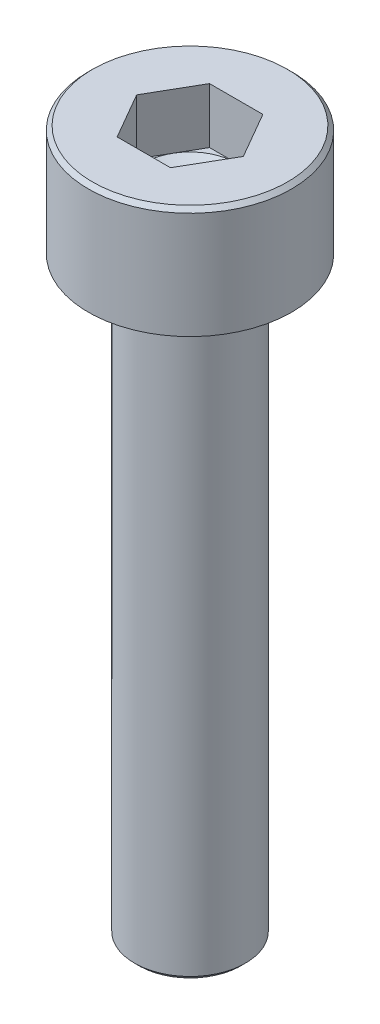
ISO-10303-21;
HEADER;
FILE_DESCRIPTION(('STEP AP214'),'2;1');
FILE_NAME('part.step','',(''),(''),'','','');
FILE_SCHEMA(('AUTOMOTIVE_DESIGN { 1 0 10303 214 1 1 1 1 }'));
ENDSEC;
DATA;
#1=APPLICATION_CONTEXT('core data for automotive mechanical design processes');
#2=APPLICATION_PROTOCOL_DEFINITION('international standard','automotive_design',2000,#1);
#3=PRODUCT_CONTEXT('',#1,'mechanical');
#4=PRODUCT('Part','Part','',(#3));
#5=PRODUCT_RELATED_PRODUCT_CATEGORY('part','',(#4));
#6=PRODUCT_DEFINITION_FORMATION('','',#4);
#7=PRODUCT_DEFINITION_CONTEXT('part definition',#1,'design');
#8=PRODUCT_DEFINITION('design','',#6,#7);
#9=PRODUCT_DEFINITION_SHAPE('','',#8);
#10=(LENGTH_UNIT() NAMED_UNIT(*) SI_UNIT(.MILLI.,.METRE.));
#11=(NAMED_UNIT(*) PLANE_ANGLE_UNIT() SI_UNIT($,.RADIAN.));
#12=(NAMED_UNIT(*) SI_UNIT($,.STERADIAN.) SOLID_ANGLE_UNIT());
#13=UNCERTAINTY_MEASURE_WITH_UNIT(LENGTH_MEASURE(1.E-05),#10,'distance_accuracy_value','');
#14=(GEOMETRIC_REPRESENTATION_CONTEXT(3) GLOBAL_UNCERTAINTY_ASSIGNED_CONTEXT((#13)) GLOBAL_UNIT_ASSIGNED_CONTEXT((#10,
#11,#12)) REPRESENTATION_CONTEXT('',''));
#15=CARTESIAN_POINT('',(0.,0.,0.));
#16=DIRECTION('',(0.,0.,1.));
#17=DIRECTION('',(1.,0.,0.));
#18=AXIS2_PLACEMENT_3D('',#15,#16,#17);
#19=CARTESIAN_POINT('',(2.75,0.,0.));
#20=DIRECTION('',(0.,1.,0.));
#21=DIRECTION('',(-1.,0.,0.));
#22=AXIS2_PLACEMENT_3D('',#19,#20,#21);
#23=PLANE('',#22);
#24=DIRECTION('',(-0.5,0.,0.866025403784439));
#25=VECTOR('',#24,1.);
#26=CARTESIAN_POINT('',(-0.721687836487033,0.,-1.25));
#27=LINE('',#26,#25);
#28=CARTESIAN_POINT('',(-0.721687836487033,0.,-1.25));
#29=VERTEX_POINT('',#28);
#30=CARTESIAN_POINT('',(-1.44337567297407,0.,0.));
#31=VERTEX_POINT('',#30);
#32=EDGE_CURVE('E160',#29,#31,#27,.T.);
#33=ORIENTED_EDGE('',*,*,#32,.F.);
#34=DIRECTION('',(-1.,0.,0.));
#35=VECTOR('',#34,1.);
#36=CARTESIAN_POINT('',(0.721687836487031,0.,-1.25));
#37=LINE('',#36,#35);
#38=CARTESIAN_POINT('',(0.721687836487031,0.,-1.25));
#39=VERTEX_POINT('',#38);
#40=EDGE_CURVE('E158',#39,#29,#37,.T.);
#41=ORIENTED_EDGE('',*,*,#40,.F.);
#42=DIRECTION('',(-0.5,0.,-0.866025403784439));
#43=VECTOR('',#42,1.);
#44=CARTESIAN_POINT('',(1.44337567297406,0.,0.));
#45=LINE('',#44,#43);
#46=CARTESIAN_POINT('',(1.44337567297406,0.,0.));
#47=VERTEX_POINT('',#46);
#48=EDGE_CURVE('E156',#47,#39,#45,.T.);
#49=ORIENTED_EDGE('',*,*,#48,.F.);
#50=DIRECTION('',(0.5,0.,-0.866025403784439));
#51=VECTOR('',#50,1.);
#52=CARTESIAN_POINT('',(0.721687836487032,0.,1.25));
#53=LINE('',#52,#51);
#54=CARTESIAN_POINT('',(0.721687836487032,0.,1.25));
#55=VERTEX_POINT('',#54);
#56=EDGE_CURVE('E154',#55,#47,#53,.T.);
#57=ORIENTED_EDGE('',*,*,#56,.F.);
#58=DIRECTION('',(1.,0.,0.));
#59=VECTOR('',#58,1.);
#60=CARTESIAN_POINT('',(-0.721687836487033,0.,1.25));
#61=LINE('',#60,#59);
#62=CARTESIAN_POINT('',(-0.721687836487033,0.,1.25));
#63=VERTEX_POINT('',#62);
#64=EDGE_CURVE('E129',#63,#55,#61,.T.);
#65=ORIENTED_EDGE('',*,*,#64,.F.);
#66=DIRECTION('',(0.5,0.,0.866025403784439));
#67=VECTOR('',#66,1.);
#68=CARTESIAN_POINT('',(-1.44337567297407,0.,0.));
#69=LINE('',#68,#67);
#70=EDGE_CURVE('E122',#31,#63,#69,.T.);
#71=ORIENTED_EDGE('',*,*,#70,.F.);
#72=EDGE_LOOP('',(#33,#41,#49,#57,#65,#71));
#73=FACE_BOUND('',#72,.T.);
#74=CARTESIAN_POINT('',(0.,0.,0.));
#75=DIRECTION('',(0.,1.,0.));
#76=DIRECTION('',(-1.,0.,0.));
#77=AXIS2_PLACEMENT_3D('',#74,#75,#76);
#78=CIRCLE('',#77,2.64);
#79=CARTESIAN_POINT('',(-2.64,0.,0.));
#80=VERTEX_POINT('',#79);
#81=EDGE_CURVE('E47',#80,#80,#78,.T.);
#82=ORIENTED_EDGE('',*,*,#81,.T.);
#83=EDGE_LOOP('',(#82));
#84=FACE_BOUND('',#83,.T.);
#85=ADVANCED_FACE('F38',(#73,#84),#23,.T.);
#86=CARTESIAN_POINT('',(1.5,-19.,0.));
#87=DIRECTION('',(0.,-1.,0.));
#88=DIRECTION('',(1.,0.,0.));
#89=AXIS2_PLACEMENT_3D('',#86,#87,#88);
#90=PLANE('',#89);
#91=CARTESIAN_POINT('',(0.,-19.,0.));
#92=DIRECTION('',(0.,-1.,0.));
#93=DIRECTION('',(1.,0.,0.));
#94=AXIS2_PLACEMENT_3D('',#91,#92,#93);
#95=CIRCLE('',#94,0.6);
#96=CARTESIAN_POINT('',(0.600000000000003,-19.,0.));
#97=VERTEX_POINT('',#96);
#98=EDGE_CURVE('E267',#97,#97,#95,.T.);
#99=ORIENTED_EDGE('',*,*,#98,.F.);
#100=EDGE_LOOP('',(#99));
#101=FACE_BOUND('',#100,.T.);
#102=CARTESIAN_POINT('',(0.,-19.,0.));
#103=DIRECTION('',(0.,-1.,0.));
#104=DIRECTION('',(1.,0.,0.));
#105=AXIS2_PLACEMENT_3D('',#102,#103,#104);
#106=CIRCLE('',#105,1.38);
#107=CARTESIAN_POINT('',(-1.38,-19.,0.));
#108=VERTEX_POINT('',#107);
#109=EDGE_CURVE('E190',#108,#108,#106,.T.);
#110=ORIENTED_EDGE('',*,*,#109,.T.);
#111=EDGE_LOOP('',(#110));
#112=FACE_BOUND('',#111,.T.);
#113=ADVANCED_FACE('F210',(#101,#112),#90,.T.);
#114=CARTESIAN_POINT('',(0.,-2.22168783648703,0.));
#115=DIRECTION('',(0.,1.,0.));
#116=DIRECTION('',(-1.,0.,0.));
#117=AXIS2_PLACEMENT_3D('',#114,#115,#116);
#118=CYLINDRICAL_SURFACE('',#117,1.5);
#119=CARTESIAN_POINT('',(0.,-18.88,0.));
#120=DIRECTION('',(0.,-1.,0.));
#121=DIRECTION('',(1.,0.,0.));
#122=AXIS2_PLACEMENT_3D('',#119,#120,#121);
#123=CIRCLE('',#122,1.5);
#124=CARTESIAN_POINT('',(-1.5,-18.88,0.));
#125=VERTEX_POINT('',#124);
#126=EDGE_CURVE('E187',#125,#125,#123,.F.);
#127=ORIENTED_EDGE('',*,*,#126,.T.);
#128=EDGE_LOOP('',(#127));
#129=FACE_BOUND('',#128,.T.);
#130=CARTESIAN_POINT('',(0.,-3.,0.));
#131=DIRECTION('',(0.,1.,0.));
#132=DIRECTION('',(-1.,0.,0.));
#133=AXIS2_PLACEMENT_3D('',#130,#131,#132);
#134=CIRCLE('',#133,1.5);
#135=CARTESIAN_POINT('',(-1.5,-3.,0.));
#136=VERTEX_POINT('',#135);
#137=EDGE_CURVE('E180',#136,#136,#134,.T.);
#138=ORIENTED_EDGE('',*,*,#137,.F.);
#139=EDGE_LOOP('',(#138));
#140=FACE_BOUND('',#139,.T.);
#141=ADVANCED_FACE('F216',(#129,#140),#118,.T.);
#142=CARTESIAN_POINT('',(1.5,-3.,0.));
#143=DIRECTION('',(0.,-1.,0.));
#144=DIRECTION('',(1.,0.,0.));
#145=AXIS2_PLACEMENT_3D('',#142,#143,#144);
#146=PLANE('',#145);
#147=ORIENTED_EDGE('',*,*,#137,.T.);
#148=EDGE_LOOP('',(#147));
#149=FACE_BOUND('',#148,.T.);
#150=CARTESIAN_POINT('',(0.,-3.,0.));
#151=DIRECTION('',(0.,1.,0.));
#152=DIRECTION('',(-1.,0.,0.));
#153=AXIS2_PLACEMENT_3D('',#150,#151,#152);
#154=CIRCLE('',#153,2.75);
#155=CARTESIAN_POINT('',(-2.75,-3.,0.));
#156=VERTEX_POINT('',#155);
#157=EDGE_CURVE('E166',#156,#156,#154,.T.);
#158=ORIENTED_EDGE('',*,*,#157,.F.);
#159=EDGE_LOOP('',(#158));
#160=FACE_BOUND('',#159,.T.);
#161=ADVANCED_FACE('F229',(#149,#160),#146,.T.);
#162=CARTESIAN_POINT('',(0.,-2.22168783648703,0.));
#163=DIRECTION('',(0.,1.,0.));
#164=DIRECTION('',(-1.,0.,0.));
#165=AXIS2_PLACEMENT_3D('',#162,#163,#164);
#166=CYLINDRICAL_SURFACE('',#165,2.75);
#167=CARTESIAN_POINT('',(0.,-0.110000000000001,0.));
#168=DIRECTION('',(0.,1.,0.));
#169=DIRECTION('',(-1.,0.,0.));
#170=AXIS2_PLACEMENT_3D('',#167,#168,#169);
#171=CIRCLE('',#170,2.75);
#172=CARTESIAN_POINT('',(-2.75,-0.110000000000001,0.));
#173=VERTEX_POINT('',#172);
#174=EDGE_CURVE('E11',#173,#173,#171,.F.);
#175=ORIENTED_EDGE('',*,*,#174,.T.);
#176=EDGE_LOOP('',(#175));
#177=FACE_BOUND('',#176,.T.);
#178=ORIENTED_EDGE('',*,*,#157,.T.);
#179=EDGE_LOOP('',(#178));
#180=FACE_BOUND('',#179,.T.);
#181=ADVANCED_FACE('F206',(#177,#180),#166,.T.);
#182=CARTESIAN_POINT('',(0.,-18.88,0.));
#183=DIRECTION('',(0.,1.,0.));
#184=DIRECTION('',(-1.,0.,0.));
#185=AXIS2_PLACEMENT_3D('',#182,#183,#184);
#186=CONICAL_SURFACE('',#185,1.5,0.785398163397451);
#187=CARTESIAN_POINT('',(-1.38,-19.,0.));
#188=CARTESIAN_POINT('',(-1.38125,-18.99875,0.));
#189=CARTESIAN_POINT('',(-1.3825,-18.9975,0.));
#190=CARTESIAN_POINT('',(-1.385,-18.995,0.));
#191=CARTESIAN_POINT('',(-1.38625,-18.99375,0.));
#192=CARTESIAN_POINT('',(-1.38875,-18.99125,0.));
#193=CARTESIAN_POINT('',(-1.39,-18.99,0.));
#194=CARTESIAN_POINT('',(-1.3925,-18.9875,0.));
#195=CARTESIAN_POINT('',(-1.39375,-18.98625,0.));
#196=CARTESIAN_POINT('',(-1.39625,-18.98375,0.));
#197=CARTESIAN_POINT('',(-1.3975,-18.9825,0.));
#198=CARTESIAN_POINT('',(-1.4,-18.98,0.));
#199=CARTESIAN_POINT('',(-1.40125,-18.97875,0.));
#200=CARTESIAN_POINT('',(-1.40375,-18.97625,0.));
#201=CARTESIAN_POINT('',(-1.405,-18.975,0.));
#202=CARTESIAN_POINT('',(-1.4075,-18.9725,0.));
#203=CARTESIAN_POINT('',(-1.40875,-18.97125,0.));
#204=CARTESIAN_POINT('',(-1.41125,-18.96875,0.));
#205=CARTESIAN_POINT('',(-1.4125,-18.9675,0.));
#206=CARTESIAN_POINT('',(-1.415,-18.965,0.));
#207=CARTESIAN_POINT('',(-1.41625,-18.96375,0.));
#208=CARTESIAN_POINT('',(-1.41875,-18.96125,0.));
#209=CARTESIAN_POINT('',(-1.42,-18.96,0.));
#210=CARTESIAN_POINT('',(-1.4225,-18.9575,0.));
#211=CARTESIAN_POINT('',(-1.42375,-18.95625,0.));
#212=CARTESIAN_POINT('',(-1.42625,-18.95375,0.));
#213=CARTESIAN_POINT('',(-1.4275,-18.9525,0.));
#214=CARTESIAN_POINT('',(-1.43,-18.95,0.));
#215=CARTESIAN_POINT('',(-1.43125,-18.94875,0.));
#216=CARTESIAN_POINT('',(-1.43375,-18.94625,0.));
#217=CARTESIAN_POINT('',(-1.435,-18.945,0.));
#218=CARTESIAN_POINT('',(-1.4375,-18.9425,0.));
#219=CARTESIAN_POINT('',(-1.43875,-18.94125,0.));
#220=CARTESIAN_POINT('',(-1.44125,-18.93875,0.));
#221=CARTESIAN_POINT('',(-1.4425,-18.9375,0.));
#222=CARTESIAN_POINT('',(-1.445,-18.935,0.));
#223=CARTESIAN_POINT('',(-1.44625,-18.93375,0.));
#224=CARTESIAN_POINT('',(-1.44875,-18.93125,0.));
#225=CARTESIAN_POINT('',(-1.45,-18.93,0.));
#226=CARTESIAN_POINT('',(-1.4525,-18.9275,0.));
#227=CARTESIAN_POINT('',(-1.45375,-18.92625,0.));
#228=CARTESIAN_POINT('',(-1.45625,-18.92375,0.));
#229=CARTESIAN_POINT('',(-1.4575,-18.9225,0.));
#230=CARTESIAN_POINT('',(-1.46,-18.92,0.));
#231=CARTESIAN_POINT('',(-1.46125,-18.91875,0.));
#232=CARTESIAN_POINT('',(-1.46375,-18.91625,0.));
#233=CARTESIAN_POINT('',(-1.465,-18.915,0.));
#234=CARTESIAN_POINT('',(-1.4675,-18.9125,0.));
#235=CARTESIAN_POINT('',(-1.46875,-18.91125,0.));
#236=CARTESIAN_POINT('',(-1.47125,-18.90875,0.));
#237=CARTESIAN_POINT('',(-1.4725,-18.9075,0.));
#238=CARTESIAN_POINT('',(-1.475,-18.905,0.));
#239=CARTESIAN_POINT('',(-1.47625,-18.90375,0.));
#240=CARTESIAN_POINT('',(-1.47875,-18.90125,0.));
#241=CARTESIAN_POINT('',(-1.48,-18.9,0.));
#242=CARTESIAN_POINT('',(-1.4825,-18.8975,0.));
#243=CARTESIAN_POINT('',(-1.48375,-18.89625,0.));
#244=CARTESIAN_POINT('',(-1.48625,-18.89375,0.));
#245=CARTESIAN_POINT('',(-1.4875,-18.8925,0.));
#246=CARTESIAN_POINT('',(-1.49,-18.89,0.));
#247=CARTESIAN_POINT('',(-1.49125,-18.88875,0.));
#248=CARTESIAN_POINT('',(-1.49375,-18.88625,0.));
#249=CARTESIAN_POINT('',(-1.495,-18.885,0.));
#250=CARTESIAN_POINT('',(-1.4975,-18.8825,0.));
#251=CARTESIAN_POINT('',(-1.49875,-18.88125,0.));
#252=CARTESIAN_POINT('',(-1.5,-18.88,0.));
#253=B_SPLINE_CURVE_WITH_KNOTS('',3,(#187,#188,#189,#190,#191,#192,#193,#194,#195,#196,#197,
#198,#199,#200,#201,#202,#203,#204,#205,#206,#207,#208,#209,#210,#211,#212,#213,#214,#215,#216,
#217,#218,#219,#220,#221,#222,#223,#224,#225,#226,#227,#228,#229,#230,#231,#232,#233,#234,#235,
#236,#237,#238,#239,#240,#241,#242,#243,#244,#245,#246,#247,#248,#249,#250,#251,#252),
.UNSPECIFIED.,.F.,.F.,(4,2,2,2,2,2,2,2,2,2,2,2,2,2,2,2,2,2,2,2,2,2,2,2,2,2,2,2,2,2,2,2,4),(0.,
0.00530330085889674,0.0106066017177959,0.0159099025766951,0.0212132034355943,0.0265165042944937,
0.0318198051533929,0.0371231060122921,0.0424264068711913,0.047729707730088,0.0530330085889872,
0.0583363094478864,0.0636396103067856,0.0689429111656848,0.074246212024584,0.0795495128834832,
0.0848528137423825,0.0901561146012793,0.0954594154601785,0.100762716319078,0.106066017177977,
0.111369318036876,0.116672618895775,0.121975919754674,0.127279220613574,0.13258252147247,
0.13788582233137,0.143189123190269,0.148492424049168,0.153795724908067,0.159099025766967,
0.164402326625866,0.169705627484765),.UNSPECIFIED.);
#254=EDGE_CURVE('BSEAM198',#108,#125,#253,.T.);
#255=ORIENTED_EDGE('',*,*,#109,.F.);
#256=ORIENTED_EDGE('',*,*,#126,.F.);
#257=ORIENTED_EDGE('',*,*,#254,.T.);
#258=ORIENTED_EDGE('',*,*,#254,.F.);
#259=EDGE_LOOP('',(#255,#257,#256,#258));
#260=FACE_BOUND('',#259,.T.);
#261=ADVANCED_FACE('F198',(#260),#186,.T.);
#262=CARTESIAN_POINT('',(0.,0.,0.));
#263=DIRECTION('',(0.,-1.,0.));
#264=DIRECTION('',(1.,0.,0.));
#265=AXIS2_PLACEMENT_3D('',#262,#263,#264);
#266=CONICAL_SURFACE('',#265,2.64,0.785398163397452);
#267=ORIENTED_EDGE('',*,*,#174,.F.);
#268=EDGE_LOOP('',(#267));
#269=FACE_BOUND('',#268,.T.);
#270=ORIENTED_EDGE('',*,*,#81,.F.);
#271=EDGE_LOOP('',(#270));
#272=FACE_BOUND('',#271,.T.);
#273=ADVANCED_FACE('F40',(#269,#272),#266,.T.);
#274=CARTESIAN_POINT('',(-0.721687836487033,-1.5,1.25));
#275=DIRECTION('',(0.,0.,1.));
#276=DIRECTION('',(1.,0.,0.));
#277=AXIS2_PLACEMENT_3D('',#274,#275,#276);
#278=PLANE('',#277);
#279=DIRECTION('',(1.,0.,0.));
#280=VECTOR('',#279,1.);
#281=CARTESIAN_POINT('',(-0.721687836487033,-1.5,1.25));
#282=LINE('',#281,#280);
#283=CARTESIAN_POINT('',(-0.721687836487033,-1.5,1.25));
#284=VERTEX_POINT('',#283);
#285=CARTESIAN_POINT('',(0.,-1.5,1.25));
#286=VERTEX_POINT('',#285);
#287=EDGE_CURVE('E121',#284,#286,#282,.T.);
#288=ORIENTED_EDGE('',*,*,#287,.F.);
#289=DIRECTION('',(0.,1.,0.));
#290=VECTOR('',#289,1.);
#291=CARTESIAN_POINT('',(-0.721687836487033,-1.5,1.25));
#292=LINE('',#291,#290);
#293=EDGE_CURVE('E164',#284,#63,#292,.T.);
#294=ORIENTED_EDGE('',*,*,#293,.T.);
#295=ORIENTED_EDGE('',*,*,#64,.T.);
#296=DIRECTION('',(0.,1.,0.));
#297=VECTOR('',#296,1.);
#298=CARTESIAN_POINT('',(0.721687836487032,-1.5,1.25));
#299=LINE('',#298,#297);
#300=CARTESIAN_POINT('',(0.721687836487032,-1.5,1.25));
#301=VERTEX_POINT('',#300);
#302=EDGE_CURVE('E125',#301,#55,#299,.T.);
#303=ORIENTED_EDGE('',*,*,#302,.F.);
#304=EDGE_CURVE('E111',#286,#301,#282,.T.);
#305=ORIENTED_EDGE('',*,*,#304,.F.);
#306=EDGE_LOOP('',(#288,#294,#295,#303,#305));
#307=FACE_BOUND('',#306,.T.);
#308=ADVANCED_FACE('F126',(#307),#278,.F.);
#309=CARTESIAN_POINT('',(-1.44337567297407,-1.5,0.));
#310=DIRECTION('',(-0.866025403784439,0.,0.5));
#311=DIRECTION('',(0.5,0.,0.866025403784439));
#312=AXIS2_PLACEMENT_3D('',#309,#310,#311);
#313=PLANE('',#312);
#314=DIRECTION('',(0.5,0.,0.866025403784439));
#315=VECTOR('',#314,1.);
#316=CARTESIAN_POINT('',(-1.44337567297407,-1.5,0.));
#317=LINE('',#316,#315);
#318=CARTESIAN_POINT('',(-1.44337567297407,-1.5,0.));
#319=VERTEX_POINT('',#318);
#320=CARTESIAN_POINT('',(-1.08253175473055,-1.5,0.625));
#321=VERTEX_POINT('',#320);
#322=EDGE_CURVE('E54',#319,#321,#317,.T.);
#323=ORIENTED_EDGE('',*,*,#322,.F.);
#324=DIRECTION('',(0.,1.,0.));
#325=VECTOR('',#324,1.);
#326=CARTESIAN_POINT('',(-1.44337567297407,-1.5,0.));
#327=LINE('',#326,#325);
#328=EDGE_CURVE('E167',#319,#31,#327,.T.);
#329=ORIENTED_EDGE('',*,*,#328,.T.);
#330=ORIENTED_EDGE('',*,*,#70,.T.);
#331=ORIENTED_EDGE('',*,*,#293,.F.);
#332=EDGE_CURVE('E151',#321,#284,#317,.T.);
#333=ORIENTED_EDGE('',*,*,#332,.F.);
#334=EDGE_LOOP('',(#323,#329,#330,#331,#333));
#335=FACE_BOUND('',#334,.T.);
#336=ADVANCED_FACE('F204',(#335),#313,.F.);
#337=CARTESIAN_POINT('',(-0.721687836487033,-1.5,-1.25));
#338=DIRECTION('',(-0.866025403784439,0.,-0.5));
#339=DIRECTION('',(-0.5,0.,0.866025403784439));
#340=AXIS2_PLACEMENT_3D('',#337,#338,#339);
#341=PLANE('',#340);
#342=DIRECTION('',(-0.5,0.,0.866025403784439));
#343=VECTOR('',#342,1.);
#344=CARTESIAN_POINT('',(-0.721687836487033,-1.5,-1.25));
#345=LINE('',#344,#343);
#346=CARTESIAN_POINT('',(-0.721687836487033,-1.5,-1.25));
#347=VERTEX_POINT('',#346);
#348=CARTESIAN_POINT('',(-1.08253175473055,-1.5,-0.625));
#349=VERTEX_POINT('',#348);
#350=EDGE_CURVE('E148',#347,#349,#345,.T.);
#351=ORIENTED_EDGE('',*,*,#350,.F.);
#352=DIRECTION('',(0.,1.,0.));
#353=VECTOR('',#352,1.);
#354=CARTESIAN_POINT('',(-0.721687836487033,-1.5,-1.25));
#355=LINE('',#354,#353);
#356=EDGE_CURVE('E170',#347,#29,#355,.T.);
#357=ORIENTED_EDGE('',*,*,#356,.T.);
#358=ORIENTED_EDGE('',*,*,#32,.T.);
#359=ORIENTED_EDGE('',*,*,#328,.F.);
#360=EDGE_CURVE('E147',#349,#319,#345,.T.);
#361=ORIENTED_EDGE('',*,*,#360,.F.);
#362=EDGE_LOOP('',(#351,#357,#358,#359,#361));
#363=FACE_BOUND('',#362,.T.);
#364=ADVANCED_FACE('F247',(#363),#341,.F.);
#365=CARTESIAN_POINT('',(0.721687836487031,-1.5,-1.25));
#366=DIRECTION('',(0.,0.,-1.));
#367=DIRECTION('',(-1.,0.,0.));
#368=AXIS2_PLACEMENT_3D('',#365,#366,#367);
#369=PLANE('',#368);
#370=DIRECTION('',(-1.,0.,0.));
#371=VECTOR('',#370,1.);
#372=CARTESIAN_POINT('',(0.721687836487031,-1.5,-1.25));
#373=LINE('',#372,#371);
#374=CARTESIAN_POINT('',(0.721687836487031,-1.5,-1.25));
#375=VERTEX_POINT('',#374);
#376=CARTESIAN_POINT('',(0.,-1.5,-1.25));
#377=VERTEX_POINT('',#376);
#378=EDGE_CURVE('E144',#375,#377,#373,.T.);
#379=ORIENTED_EDGE('',*,*,#378,.F.);
#380=DIRECTION('',(0.,1.,0.));
#381=VECTOR('',#380,1.);
#382=CARTESIAN_POINT('',(0.721687836487031,-1.5,-1.25));
#383=LINE('',#382,#381);
#384=EDGE_CURVE('E173',#375,#39,#383,.T.);
#385=ORIENTED_EDGE('',*,*,#384,.T.);
#386=ORIENTED_EDGE('',*,*,#40,.T.);
#387=ORIENTED_EDGE('',*,*,#356,.F.);
#388=EDGE_CURVE('E143',#377,#347,#373,.T.);
#389=ORIENTED_EDGE('',*,*,#388,.F.);
#390=EDGE_LOOP('',(#379,#385,#386,#387,#389));
#391=FACE_BOUND('',#390,.T.);
#392=ADVANCED_FACE('F243',(#391),#369,.F.);
#393=CARTESIAN_POINT('',(1.44337567297406,-1.5,0.));
#394=DIRECTION('',(0.866025403784439,0.,-0.5));
#395=DIRECTION('',(-0.5,0.,-0.866025403784439));
#396=AXIS2_PLACEMENT_3D('',#393,#394,#395);
#397=PLANE('',#396);
#398=DIRECTION('',(-0.5,0.,-0.866025403784439));
#399=VECTOR('',#398,1.);
#400=CARTESIAN_POINT('',(1.44337567297406,-1.5,0.));
#401=LINE('',#400,#399);
#402=CARTESIAN_POINT('',(1.44337567297406,-1.5,0.));
#403=VERTEX_POINT('',#402);
#404=CARTESIAN_POINT('',(1.08253175473055,-1.5,-0.625));
#405=VERTEX_POINT('',#404);
#406=EDGE_CURVE('E139',#403,#405,#401,.T.);
#407=ORIENTED_EDGE('',*,*,#406,.F.);
#408=DIRECTION('',(0.,1.,0.));
#409=VECTOR('',#408,1.);
#410=CARTESIAN_POINT('',(1.44337567297406,-1.5,0.));
#411=LINE('',#410,#409);
#412=EDGE_CURVE('E132',#403,#47,#411,.T.);
#413=ORIENTED_EDGE('',*,*,#412,.T.);
#414=ORIENTED_EDGE('',*,*,#48,.T.);
#415=ORIENTED_EDGE('',*,*,#384,.F.);
#416=EDGE_CURVE('E137',#405,#375,#401,.T.);
#417=ORIENTED_EDGE('',*,*,#416,.F.);
#418=EDGE_LOOP('',(#407,#413,#414,#415,#417));
#419=FACE_BOUND('',#418,.T.);
#420=ADVANCED_FACE('F240',(#419),#397,.F.);
#421=CARTESIAN_POINT('',(0.721687836487032,-1.5,1.25));
#422=DIRECTION('',(0.866025403784439,0.,0.5));
#423=DIRECTION('',(0.5,0.,-0.866025403784439));
#424=AXIS2_PLACEMENT_3D('',#421,#422,#423);
#425=PLANE('',#424);
#426=DIRECTION('',(0.5,0.,-0.866025403784439));
#427=VECTOR('',#426,1.);
#428=CARTESIAN_POINT('',(0.721687836487032,-1.5,1.25));
#429=LINE('',#428,#427);
#430=CARTESIAN_POINT('',(1.08253175473055,-1.5,0.625));
#431=VERTEX_POINT('',#430);
#432=EDGE_CURVE('E115',#301,#431,#429,.T.);
#433=ORIENTED_EDGE('',*,*,#432,.F.);
#434=ORIENTED_EDGE('',*,*,#302,.T.);
#435=ORIENTED_EDGE('',*,*,#56,.T.);
#436=ORIENTED_EDGE('',*,*,#412,.F.);
#437=EDGE_CURVE('E136',#431,#403,#429,.T.);
#438=ORIENTED_EDGE('',*,*,#437,.F.);
#439=EDGE_LOOP('',(#433,#434,#435,#436,#438));
#440=FACE_BOUND('',#439,.T.);
#441=ADVANCED_FACE('F134',(#440),#425,.F.);
#442=CARTESIAN_POINT('',(0.721687836487032,-1.5,1.25));
#443=DIRECTION('',(0.,1.,0.));
#444=DIRECTION('',(-1.,0.,0.));
#445=AXIS2_PLACEMENT_3D('',#442,#443,#444);
#446=PLANE('',#445);
#447=ORIENTED_EDGE('',*,*,#332,.T.);
#448=ORIENTED_EDGE('',*,*,#287,.T.);
#449=CARTESIAN_POINT('',(0.,-1.5,0.));
#450=DIRECTION('',(0.,1.,0.));
#451=DIRECTION('',(-1.,0.,0.));
#452=AXIS2_PLACEMENT_3D('',#449,#450,#451);
#453=CIRCLE('',#452,1.25);
#454=EDGE_CURVE('E184',#321,#286,#453,.T.);
#455=ORIENTED_EDGE('',*,*,#454,.F.);
#456=EDGE_LOOP('',(#447,#448,#455));
#457=FACE_BOUND('',#456,.T.);
#458=ADVANCED_FACE('F239',(#457),#446,.T.);
#459=ORIENTED_EDGE('',*,*,#304,.T.);
#460=ORIENTED_EDGE('',*,*,#432,.T.);
#461=EDGE_CURVE('E117',#286,#431,#453,.T.);
#462=ORIENTED_EDGE('',*,*,#461,.F.);
#463=EDGE_LOOP('',(#459,#460,#462));
#464=FACE_BOUND('',#463,.T.);
#465=ADVANCED_FACE('F113',(#464),#446,.T.);
#466=ORIENTED_EDGE('',*,*,#437,.T.);
#467=ORIENTED_EDGE('',*,*,#406,.T.);
#468=EDGE_CURVE('E62',#431,#405,#453,.T.);
#469=ORIENTED_EDGE('',*,*,#468,.F.);
#470=EDGE_LOOP('',(#466,#467,#469));
#471=FACE_BOUND('',#470,.T.);
#472=ADVANCED_FACE('F288',(#471),#446,.T.);
#473=ORIENTED_EDGE('',*,*,#416,.T.);
#474=ORIENTED_EDGE('',*,*,#378,.T.);
#475=EDGE_CURVE('E290',#405,#377,#453,.T.);
#476=ORIENTED_EDGE('',*,*,#475,.F.);
#477=EDGE_LOOP('',(#473,#474,#476));
#478=FACE_BOUND('',#477,.T.);
#479=ADVANCED_FACE('F298',(#478),#446,.T.);
#480=ORIENTED_EDGE('',*,*,#388,.T.);
#481=ORIENTED_EDGE('',*,*,#350,.T.);
#482=EDGE_CURVE('E291',#377,#349,#453,.T.);
#483=ORIENTED_EDGE('',*,*,#482,.F.);
#484=EDGE_LOOP('',(#480,#481,#483));
#485=FACE_BOUND('',#484,.T.);
#486=ADVANCED_FACE('F257',(#485),#446,.T.);
#487=ORIENTED_EDGE('',*,*,#360,.T.);
#488=ORIENTED_EDGE('',*,*,#322,.T.);
#489=EDGE_CURVE('E183',#349,#321,#453,.T.);
#490=ORIENTED_EDGE('',*,*,#489,.F.);
#491=EDGE_LOOP('',(#487,#488,#490));
#492=FACE_BOUND('',#491,.T.);
#493=ADVANCED_FACE('F224',(#492),#446,.T.);
#494=CARTESIAN_POINT('',(0.,-2.22168783648703,0.));
#495=DIRECTION('',(0.,1.,0.));
#496=DIRECTION('',(-1.,0.,0.));
#497=AXIS2_PLACEMENT_3D('',#494,#495,#496);
#498=CONICAL_SURFACE('',#497,0.,1.0471975511966);
#499=CARTESIAN_POINT('',(0.,-1.87527767497325,0.));
#500=DIRECTION('',(0.,1.,0.));
#501=DIRECTION('',(-1.,0.,0.));
#502=AXIS2_PLACEMENT_3D('',#499,#500,#501);
#503=CIRCLE('',#502,0.6);
#504=CARTESIAN_POINT('',(-0.6,-1.87527767497325,0.));
#505=VERTEX_POINT('',#504);
#506=EDGE_CURVE('E42',#505,#505,#503,.T.);
#507=ORIENTED_EDGE('',*,*,#506,.F.);
#508=EDGE_LOOP('',(#507));
#509=FACE_BOUND('',#508,.T.);
#510=ORIENTED_EDGE('',*,*,#454,.T.);
#511=ORIENTED_EDGE('',*,*,#461,.T.);
#512=ORIENTED_EDGE('',*,*,#468,.T.);
#513=ORIENTED_EDGE('',*,*,#475,.T.);
#514=ORIENTED_EDGE('',*,*,#482,.T.);
#515=ORIENTED_EDGE('',*,*,#489,.T.);
#516=EDGE_LOOP('',(#510,#511,#512,#513,#514,#515));
#517=FACE_BOUND('',#516,.T.);
#518=ADVANCED_FACE('F221',(#509,#517),#498,.F.);
#519=CARTESIAN_POINT('',(0.,0.,0.));
#520=DIRECTION('',(0.,-1.,0.));
#521=DIRECTION('',(1.,0.,0.));
#522=AXIS2_PLACEMENT_3D('',#519,#520,#521);
#523=CYLINDRICAL_SURFACE('',#522,0.6);
#524=ORIENTED_EDGE('',*,*,#506,.T.);
#525=EDGE_LOOP('',(#524));
#526=FACE_BOUND('',#525,.T.);
#527=ORIENTED_EDGE('',*,*,#98,.T.);
#528=EDGE_LOOP('',(#527));
#529=FACE_BOUND('',#528,.T.);
#530=ADVANCED_FACE('F223',(#526,#529),#523,.F.);
#531=CLOSED_SHELL('',(#85,#113,#141,#161,#181,#261,#273,#308,#336,#364,#392,#420,#441,#458,#465,
#472,#479,#486,#493,#518,#530));
#532=MANIFOLD_SOLID_BREP('B2',#531);
#533=ADVANCED_BREP_SHAPE_REPRESENTATION('',(#18,#532),#14);
#534=SHAPE_DEFINITION_REPRESENTATION(#9,#533);
ENDSEC;
END-ISO-10303-21;
